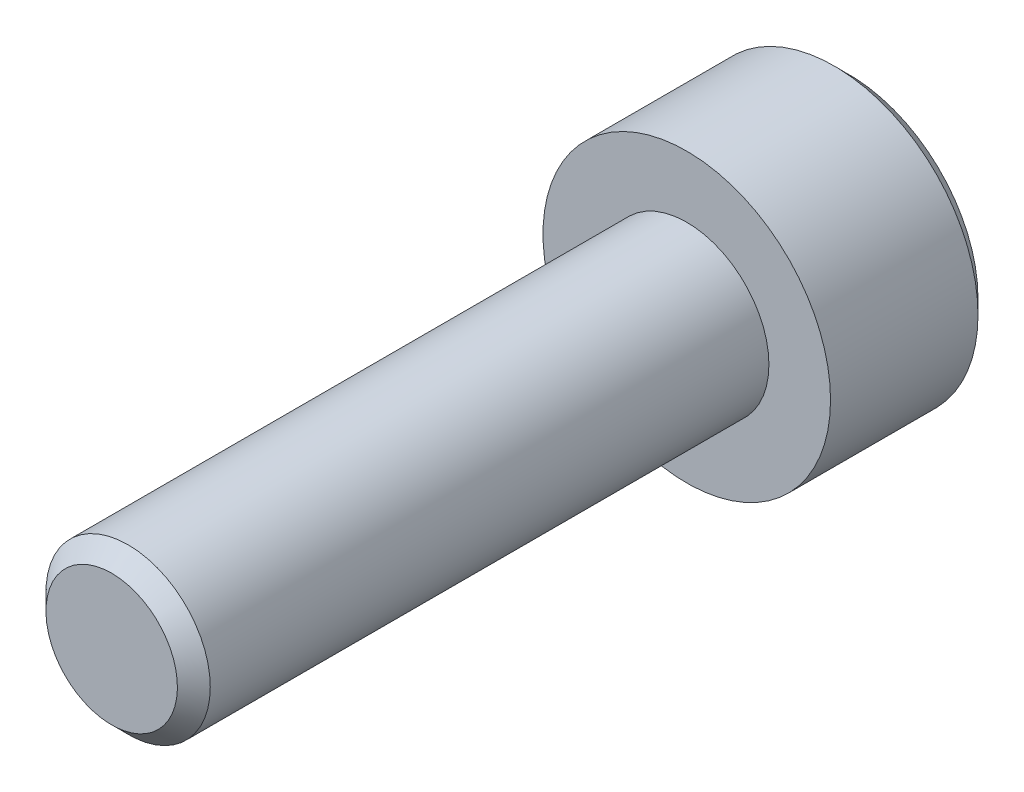
ISO-10303-21;
HEADER;
FILE_DESCRIPTION(('STEP AP214'),'2;1');
FILE_NAME('part.step','',(''),(''),'','','');
FILE_SCHEMA(('AUTOMOTIVE_DESIGN { 1 0 10303 214 1 1 1 1 }'));
ENDSEC;
DATA;
#1=APPLICATION_CONTEXT('core data for automotive mechanical design processes');
#2=APPLICATION_PROTOCOL_DEFINITION('international standard','automotive_design',2000,#1);
#3=PRODUCT_CONTEXT('',#1,'mechanical');
#4=PRODUCT('Part','Part','',(#3));
#5=PRODUCT_RELATED_PRODUCT_CATEGORY('part','',(#4));
#6=PRODUCT_DEFINITION_FORMATION('','',#4);
#7=PRODUCT_DEFINITION_CONTEXT('part definition',#1,'design');
#8=PRODUCT_DEFINITION('design','',#6,#7);
#9=PRODUCT_DEFINITION_SHAPE('','',#8);
#10=(LENGTH_UNIT() NAMED_UNIT(*) SI_UNIT(.MILLI.,.METRE.));
#11=(NAMED_UNIT(*) PLANE_ANGLE_UNIT() SI_UNIT($,.RADIAN.));
#12=(NAMED_UNIT(*) SI_UNIT($,.STERADIAN.) SOLID_ANGLE_UNIT());
#13=UNCERTAINTY_MEASURE_WITH_UNIT(LENGTH_MEASURE(1.E-05),#10,'distance_accuracy_value','');
#14=(GEOMETRIC_REPRESENTATION_CONTEXT(3) GLOBAL_UNCERTAINTY_ASSIGNED_CONTEXT((#13)) GLOBAL_UNIT_ASSIGNED_CONTEXT((#10,
#11,#12)) REPRESENTATION_CONTEXT('',''));
#15=CARTESIAN_POINT('',(0.,0.,0.));
#16=DIRECTION('',(0.,0.,1.));
#17=DIRECTION('',(1.,0.,0.));
#18=AXIS2_PLACEMENT_3D('',#15,#16,#17);
#19=CARTESIAN_POINT('',(0.,-1.73205080756888,-3.94));
#20=DIRECTION('',(-0.5,-0.866025403784438,0.));
#21=DIRECTION('',(0.866025403784438,-0.5,0.));
#22=AXIS2_PLACEMENT_3D('',#19,#20,#21);
#23=PLANE('',#22);
#24=DIRECTION('',(0.866025403784438,-0.5,0.));
#25=VECTOR('',#24,1.);
#26=CARTESIAN_POINT('',(0.,-1.73205080756888,-1.94));
#27=LINE('',#26,#25);
#28=CARTESIAN_POINT('',(0.,-1.73205080756888,-1.94));
#29=VERTEX_POINT('',#28);
#30=CARTESIAN_POINT('',(-1.5,-0.866025403784439,-1.94));
#31=VERTEX_POINT('',#30);
#32=EDGE_CURVE('E66',#29,#31,#27,.F.);
#33=ORIENTED_EDGE('',*,*,#32,.F.);
#34=DIRECTION('',(0.,0.,1.));
#35=VECTOR('',#34,1.);
#36=CARTESIAN_POINT('',(0.,-1.73205080756888,-3.94));
#37=LINE('',#36,#35);
#38=CARTESIAN_POINT('',(0.,-1.73205080756888,-3.94));
#39=VERTEX_POINT('',#38);
#40=EDGE_CURVE('E87',#29,#39,#37,.F.);
#41=ORIENTED_EDGE('',*,*,#40,.T.);
#42=DIRECTION('',(0.866025403784438,-0.5,0.));
#43=VECTOR('',#42,1.);
#44=CARTESIAN_POINT('',(0.,-1.73205080756888,-3.94));
#45=LINE('',#44,#43);
#46=CARTESIAN_POINT('',(-1.5,-0.866025403784439,-3.94));
#47=VERTEX_POINT('',#46);
#48=EDGE_CURVE('E75',#47,#39,#45,.T.);
#49=ORIENTED_EDGE('',*,*,#48,.F.);
#50=DIRECTION('',(0.,0.,1.));
#51=VECTOR('',#50,1.);
#52=CARTESIAN_POINT('',(-1.5,-0.866025403784438,-3.94));
#53=LINE('',#52,#51);
#54=EDGE_CURVE('E82',#47,#31,#53,.T.);
#55=ORIENTED_EDGE('',*,*,#54,.T.);
#56=EDGE_LOOP('',(#33,#41,#49,#55));
#57=FACE_BOUND('',#56,.T.);
#58=ADVANCED_FACE('F17',(#57),#23,.F.);
#59=CARTESIAN_POINT('',(-1.5,-0.866025403784438,-3.94));
#60=DIRECTION('',(-1.,0.,0.));
#61=DIRECTION('',(0.,0.,1.));
#62=AXIS2_PLACEMENT_3D('',#59,#60,#61);
#63=PLANE('',#62);
#64=DIRECTION('',(0.,1.,0.));
#65=VECTOR('',#64,1.);
#66=CARTESIAN_POINT('',(-1.5,-0.866025403784438,-1.94));
#67=LINE('',#66,#65);
#68=CARTESIAN_POINT('',(-1.5,0.866025403784438,-1.94));
#69=VERTEX_POINT('',#68);
#70=EDGE_CURVE('E92',#31,#69,#67,.T.);
#71=ORIENTED_EDGE('',*,*,#70,.F.);
#72=ORIENTED_EDGE('',*,*,#54,.F.);
#73=DIRECTION('',(0.,1.,0.));
#74=VECTOR('',#73,1.);
#75=CARTESIAN_POINT('',(-1.5,-0.866025403784438,-3.94));
#76=LINE('',#75,#74);
#77=CARTESIAN_POINT('',(-1.5,0.866025403784438,-3.94));
#78=VERTEX_POINT('',#77);
#79=EDGE_CURVE('E71',#78,#47,#76,.F.);
#80=ORIENTED_EDGE('',*,*,#79,.F.);
#81=DIRECTION('',(0.,0.,1.));
#82=VECTOR('',#81,1.);
#83=CARTESIAN_POINT('',(-1.5,0.866025403784438,-3.94));
#84=LINE('',#83,#82);
#85=EDGE_CURVE('E154',#78,#69,#84,.T.);
#86=ORIENTED_EDGE('',*,*,#85,.T.);
#87=EDGE_LOOP('',(#71,#72,#80,#86));
#88=FACE_BOUND('',#87,.T.);
#89=ADVANCED_FACE('F91',(#88),#63,.F.);
#90=CARTESIAN_POINT('',(1.5,-0.866025403784438,-3.94));
#91=DIRECTION('',(0.499999999999999,-0.866025403784439,0.));
#92=DIRECTION('',(0.866025403784439,0.499999999999999,0.));
#93=AXIS2_PLACEMENT_3D('',#90,#91,#92);
#94=PLANE('',#93);
#95=DIRECTION('',(0.866025403784438,0.500000000000001,0.));
#96=VECTOR('',#95,1.);
#97=CARTESIAN_POINT('',(0.,-1.73205080756888,-1.94));
#98=LINE('',#97,#96);
#99=CARTESIAN_POINT('',(1.5,-0.866025403784438,-1.94));
#100=VERTEX_POINT('',#99);
#101=EDGE_CURVE('E151',#29,#100,#98,.T.);
#102=ORIENTED_EDGE('',*,*,#101,.T.);
#103=DIRECTION('',(0.,0.,-1.));
#104=VECTOR('',#103,1.);
#105=CARTESIAN_POINT('',(1.5,-0.866025403784438,-3.94));
#106=LINE('',#105,#104);
#107=CARTESIAN_POINT('',(1.5,-0.866025403784438,-3.94));
#108=VERTEX_POINT('',#107);
#109=EDGE_CURVE('E136',#100,#108,#106,.T.);
#110=ORIENTED_EDGE('',*,*,#109,.T.);
#111=DIRECTION('',(0.866025403784439,0.499999999999999,0.));
#112=VECTOR('',#111,1.);
#113=CARTESIAN_POINT('',(1.5,-0.866025403784438,-3.94));
#114=LINE('',#113,#112);
#115=EDGE_CURVE('E98',#39,#108,#114,.T.);
#116=ORIENTED_EDGE('',*,*,#115,.F.);
#117=ORIENTED_EDGE('',*,*,#40,.F.);
#118=EDGE_LOOP('',(#102,#110,#116,#117));
#119=FACE_BOUND('',#118,.T.);
#120=ADVANCED_FACE('F163',(#119),#94,.F.);
#121=CARTESIAN_POINT('',(-1.5,0.866025403784438,-3.94));
#122=DIRECTION('',(-0.5,0.866025403784439,0.));
#123=DIRECTION('',(-0.866025403784439,-0.5,0.));
#124=AXIS2_PLACEMENT_3D('',#121,#122,#123);
#125=PLANE('',#124);
#126=DIRECTION('',(-0.866025403784438,-0.500000000000001,0.));
#127=VECTOR('',#126,1.);
#128=CARTESIAN_POINT('',(0.,1.73205080756888,-1.94));
#129=LINE('',#128,#127);
#130=CARTESIAN_POINT('',(0.,1.73205080756888,-1.94));
#131=VERTEX_POINT('',#130);
#132=EDGE_CURVE('E147',#131,#69,#129,.T.);
#133=ORIENTED_EDGE('',*,*,#132,.T.);
#134=ORIENTED_EDGE('',*,*,#85,.F.);
#135=DIRECTION('',(-0.866025403784439,-0.5,0.));
#136=VECTOR('',#135,1.);
#137=CARTESIAN_POINT('',(-1.5,0.866025403784438,-3.94));
#138=LINE('',#137,#136);
#139=CARTESIAN_POINT('',(0.,1.73205080756888,-3.94));
#140=VERTEX_POINT('',#139);
#141=EDGE_CURVE('E36',#140,#78,#138,.T.);
#142=ORIENTED_EDGE('',*,*,#141,.F.);
#143=DIRECTION('',(0.,0.,1.));
#144=VECTOR('',#143,1.);
#145=CARTESIAN_POINT('',(0.,1.73205080756888,-3.94));
#146=LINE('',#145,#144);
#147=EDGE_CURVE('E133',#140,#131,#146,.T.);
#148=ORIENTED_EDGE('',*,*,#147,.T.);
#149=EDGE_LOOP('',(#133,#134,#142,#148));
#150=FACE_BOUND('',#149,.T.);
#151=ADVANCED_FACE('F172',(#150),#125,.F.);
#152=CARTESIAN_POINT('',(0.,0.,-1.94));
#153=DIRECTION('',(0.,0.,1.));
#154=DIRECTION('',(1.,0.,0.));
#155=AXIS2_PLACEMENT_3D('',#152,#153,#154);
#156=PLANE('',#155);
#157=DIRECTION('',(-0.866025403784439,0.5,0.));
#158=VECTOR('',#157,1.);
#159=CARTESIAN_POINT('',(0.,1.73205080756888,-1.94));
#160=LINE('',#159,#158);
#161=CARTESIAN_POINT('',(1.5,0.866025403784439,-1.94));
#162=VERTEX_POINT('',#161);
#163=EDGE_CURVE('E131',#131,#162,#160,.F.);
#164=ORIENTED_EDGE('',*,*,#163,.T.);
#165=DIRECTION('',(0.,1.,0.));
#166=VECTOR('',#165,1.);
#167=CARTESIAN_POINT('',(1.5,0.866025403784438,-1.94));
#168=LINE('',#167,#166);
#169=EDGE_CURVE('E140',#162,#100,#168,.F.);
#170=ORIENTED_EDGE('',*,*,#169,.T.);
#171=ORIENTED_EDGE('',*,*,#101,.F.);
#172=ORIENTED_EDGE('',*,*,#32,.T.);
#173=ORIENTED_EDGE('',*,*,#70,.T.);
#174=ORIENTED_EDGE('',*,*,#132,.F.);
#175=EDGE_LOOP('',(#164,#170,#171,#172,#173,#174));
#176=FACE_BOUND('',#175,.T.);
#177=ADVANCED_FACE('F173',(#176),#156,.F.);
#178=CARTESIAN_POINT('',(1.5,0.866025403784438,-3.94));
#179=DIRECTION('',(1.,0.,0.));
#180=DIRECTION('',(0.,0.,-1.));
#181=AXIS2_PLACEMENT_3D('',#178,#179,#180);
#182=PLANE('',#181);
#183=ORIENTED_EDGE('',*,*,#169,.F.);
#184=DIRECTION('',(0.,0.,1.));
#185=VECTOR('',#184,1.);
#186=CARTESIAN_POINT('',(1.5,0.866025403784441,-3.94));
#187=LINE('',#186,#185);
#188=CARTESIAN_POINT('',(1.5,0.866025403784439,-3.94));
#189=VERTEX_POINT('',#188);
#190=EDGE_CURVE('E127',#162,#189,#187,.F.);
#191=ORIENTED_EDGE('',*,*,#190,.T.);
#192=DIRECTION('',(0.,1.,0.));
#193=VECTOR('',#192,1.);
#194=CARTESIAN_POINT('',(1.5,0.866025403784438,-3.94));
#195=LINE('',#194,#193);
#196=EDGE_CURVE('E144',#108,#189,#195,.T.);
#197=ORIENTED_EDGE('',*,*,#196,.F.);
#198=ORIENTED_EDGE('',*,*,#109,.F.);
#199=EDGE_LOOP('',(#183,#191,#197,#198));
#200=FACE_BOUND('',#199,.T.);
#201=ADVANCED_FACE('F166',(#200),#182,.F.);
#202=CARTESIAN_POINT('',(0.,1.73205080756888,-3.94));
#203=DIRECTION('',(0.5,0.866025403784439,0.));
#204=DIRECTION('',(-0.866025403784439,0.5,0.));
#205=AXIS2_PLACEMENT_3D('',#202,#203,#204);
#206=PLANE('',#205);
#207=ORIENTED_EDGE('',*,*,#163,.F.);
#208=ORIENTED_EDGE('',*,*,#147,.F.);
#209=DIRECTION('',(0.866025403784438,-0.500000000000002,0.));
#210=VECTOR('',#209,1.);
#211=CARTESIAN_POINT('',(0.,1.73205080756888,-3.94));
#212=LINE('',#211,#210);
#213=EDGE_CURVE('E121',#140,#189,#212,.T.);
#214=ORIENTED_EDGE('',*,*,#213,.T.);
#215=ORIENTED_EDGE('',*,*,#190,.F.);
#216=EDGE_LOOP('',(#207,#208,#214,#215));
#217=FACE_BOUND('',#216,.T.);
#218=ADVANCED_FACE('F170',(#217),#206,.F.);
#219=CARTESIAN_POINT('',(0.,0.,-3.94));
#220=DIRECTION('',(0.,0.,1.));
#221=DIRECTION('',(1.,0.,0.));
#222=AXIS2_PLACEMENT_3D('',#219,#220,#221);
#223=PLANE('',#222);
#224=ORIENTED_EDGE('',*,*,#141,.T.);
#225=ORIENTED_EDGE('',*,*,#79,.T.);
#226=ORIENTED_EDGE('',*,*,#48,.T.);
#227=ORIENTED_EDGE('',*,*,#115,.T.);
#228=ORIENTED_EDGE('',*,*,#196,.T.);
#229=ORIENTED_EDGE('',*,*,#213,.F.);
#230=EDGE_LOOP('',(#224,#225,#226,#227,#228,#229));
#231=FACE_BOUND('',#230,.T.);
#232=CARTESIAN_POINT('',(0.,0.,-3.9400000000569));
#233=DIRECTION('',(0.,0.,1.));
#234=DIRECTION('',(1.,0.,0.));
#235=AXIS2_PLACEMENT_3D('',#232,#233,#234);
#236=CIRCLE('',#235,3.14999999994825);
#237=CARTESIAN_POINT('',(3.14999999994825,0.,-3.9400000000569));
#238=VERTEX_POINT('',#237);
#239=EDGE_CURVE('E20',#238,#238,#236,.T.);
#240=ORIENTED_EDGE('',*,*,#239,.F.);
#241=EDGE_LOOP('',(#240));
#242=FACE_BOUND('',#241,.T.);
#243=ADVANCED_FACE('F73',(#231,#242),#223,.F.);
#244=CARTESIAN_POINT('',(0.,0.,-3.59000000003107));
#245=DIRECTION('',(0.,0.,1.));
#246=DIRECTION('',(1.,0.,0.));
#247=AXIS2_PLACEMENT_3D('',#244,#245,#246);
#248=CONICAL_SURFACE('',#247,3.49999999997408,0.785398163397448);
#249=ORIENTED_EDGE('',*,*,#239,.T.);
#250=EDGE_LOOP('',(#249));
#251=FACE_BOUND('',#250,.T.);
#252=CARTESIAN_POINT('',(0.,0.,-3.59));
#253=DIRECTION('',(0.,0.,1.));
#254=DIRECTION('',(1.,0.,0.));
#255=AXIS2_PLACEMENT_3D('',#252,#253,#254);
#256=CIRCLE('',#255,3.5);
#257=CARTESIAN_POINT('',(3.5,0.,-3.59));
#258=VERTEX_POINT('',#257);
#259=EDGE_CURVE('E109',#258,#258,#256,.T.);
#260=ORIENTED_EDGE('',*,*,#259,.F.);
#261=EDGE_LOOP('',(#260));
#262=FACE_BOUND('',#261,.T.);
#263=ADVANCED_FACE('F203',(#251,#262),#248,.T.);
#264=CARTESIAN_POINT('',(0.,0.,14.));
#265=DIRECTION('',(0.,0.,1.));
#266=DIRECTION('',(1.,0.,0.));
#267=AXIS2_PLACEMENT_3D('',#264,#265,#266);
#268=PLANE('',#267);
#269=CARTESIAN_POINT('',(0.,0.,13.9999999998963));
#270=DIRECTION('',(0.,0.,-1.));
#271=DIRECTION('',(0.,1.,0.));
#272=AXIS2_PLACEMENT_3D('',#269,#270,#271);
#273=CIRCLE('',#272,1.59999999999627);
#274=CARTESIAN_POINT('',(0.,1.59999999999627,13.9999999998963));
#275=VERTEX_POINT('',#274);
#276=EDGE_CURVE('E106',#275,#275,#273,.T.);
#277=ORIENTED_EDGE('',*,*,#276,.F.);
#278=EDGE_LOOP('',(#277));
#279=FACE_BOUND('',#278,.T.);
#280=ADVANCED_FACE('F200',(#279),#268,.T.);
#281=CARTESIAN_POINT('',(0.,0.,-3.94));
#282=DIRECTION('',(0.,0.,1.));
#283=DIRECTION('',(1.,0.,0.));
#284=AXIS2_PLACEMENT_3D('',#281,#282,#283);
#285=CYLINDRICAL_SURFACE('',#284,3.5);
#286=ORIENTED_EDGE('',*,*,#259,.T.);
#287=EDGE_LOOP('',(#286));
#288=FACE_BOUND('',#287,.T.);
#289=CARTESIAN_POINT('',(0.,0.,0.));
#290=DIRECTION('',(0.,0.,1.));
#291=DIRECTION('',(1.,0.,0.));
#292=AXIS2_PLACEMENT_3D('',#289,#290,#291);
#293=CIRCLE('',#292,3.5);
#294=CARTESIAN_POINT('',(3.5,0.,0.));
#295=VERTEX_POINT('',#294);
#296=EDGE_CURVE('E103',#295,#295,#293,.T.);
#297=ORIENTED_EDGE('',*,*,#296,.F.);
#298=EDGE_LOOP('',(#297));
#299=FACE_BOUND('',#298,.T.);
#300=ADVANCED_FACE('F196',(#288,#299),#285,.T.);
#301=CARTESIAN_POINT('',(0.,0.,13.6000000000536));
#302=DIRECTION('',(0.,0.,-1.));
#303=DIRECTION('',(0.,1.,0.));
#304=AXIS2_PLACEMENT_3D('',#301,#302,#303);
#305=CONICAL_SURFACE('',#304,1.99999999989586,0.785398163468503);
#306=CARTESIAN_POINT('',(0.,0.,13.6));
#307=DIRECTION('',(0.,0.,1.));
#308=DIRECTION('',(1.,0.,0.));
#309=AXIS2_PLACEMENT_3D('',#306,#307,#308);
#310=CIRCLE('',#309,2.);
#311=CARTESIAN_POINT('',(2.,0.,13.6));
#312=VERTEX_POINT('',#311);
#313=EDGE_CURVE('E27',#312,#312,#310,.F.);
#314=ORIENTED_EDGE('',*,*,#313,.F.);
#315=EDGE_LOOP('',(#314));
#316=FACE_BOUND('',#315,.T.);
#317=ORIENTED_EDGE('',*,*,#276,.T.);
#318=EDGE_LOOP('',(#317));
#319=FACE_BOUND('',#318,.T.);
#320=ADVANCED_FACE('F189',(#316,#319),#305,.T.);
#321=CARTESIAN_POINT('',(0.,0.,0.));
#322=DIRECTION('',(0.,0.,1.));
#323=DIRECTION('',(1.,0.,0.));
#324=AXIS2_PLACEMENT_3D('',#321,#322,#323);
#325=PLANE('',#324);
#326=CARTESIAN_POINT('',(0.,0.,0.));
#327=DIRECTION('',(0.,0.,1.));
#328=DIRECTION('',(1.,0.,0.));
#329=AXIS2_PLACEMENT_3D('',#326,#327,#328);
#330=CIRCLE('',#329,2.);
#331=CARTESIAN_POINT('',(2.,0.,0.));
#332=VERTEX_POINT('',#331);
#333=EDGE_CURVE('E11',#332,#332,#330,.T.);
#334=ORIENTED_EDGE('',*,*,#333,.F.);
#335=EDGE_LOOP('',(#334));
#336=FACE_BOUND('',#335,.T.);
#337=ORIENTED_EDGE('',*,*,#296,.T.);
#338=EDGE_LOOP('',(#337));
#339=FACE_BOUND('',#338,.T.);
#340=ADVANCED_FACE('F184',(#336,#339),#325,.T.);
#341=CARTESIAN_POINT('',(0.,0.,0.));
#342=DIRECTION('',(0.,0.,1.));
#343=DIRECTION('',(1.,0.,0.));
#344=AXIS2_PLACEMENT_3D('',#341,#342,#343);
#345=CYLINDRICAL_SURFACE('',#344,2.);
#346=ORIENTED_EDGE('',*,*,#333,.T.);
#347=EDGE_LOOP('',(#346));
#348=FACE_BOUND('',#347,.T.);
#349=ORIENTED_EDGE('',*,*,#313,.T.);
#350=EDGE_LOOP('',(#349));
#351=FACE_BOUND('',#350,.T.);
#352=ADVANCED_FACE('F182',(#348,#351),#345,.T.);
#353=CLOSED_SHELL('',(#58,#89,#120,#151,#177,#201,#218,#243,#263,#280,#300,#320,#340,#352));
#354=MANIFOLD_SOLID_BREP('B1',#353);
#355=ADVANCED_BREP_SHAPE_REPRESENTATION('',(#18,#354),#14);
#356=SHAPE_DEFINITION_REPRESENTATION(#9,#355);
ENDSEC;
END-ISO-10303-21;
